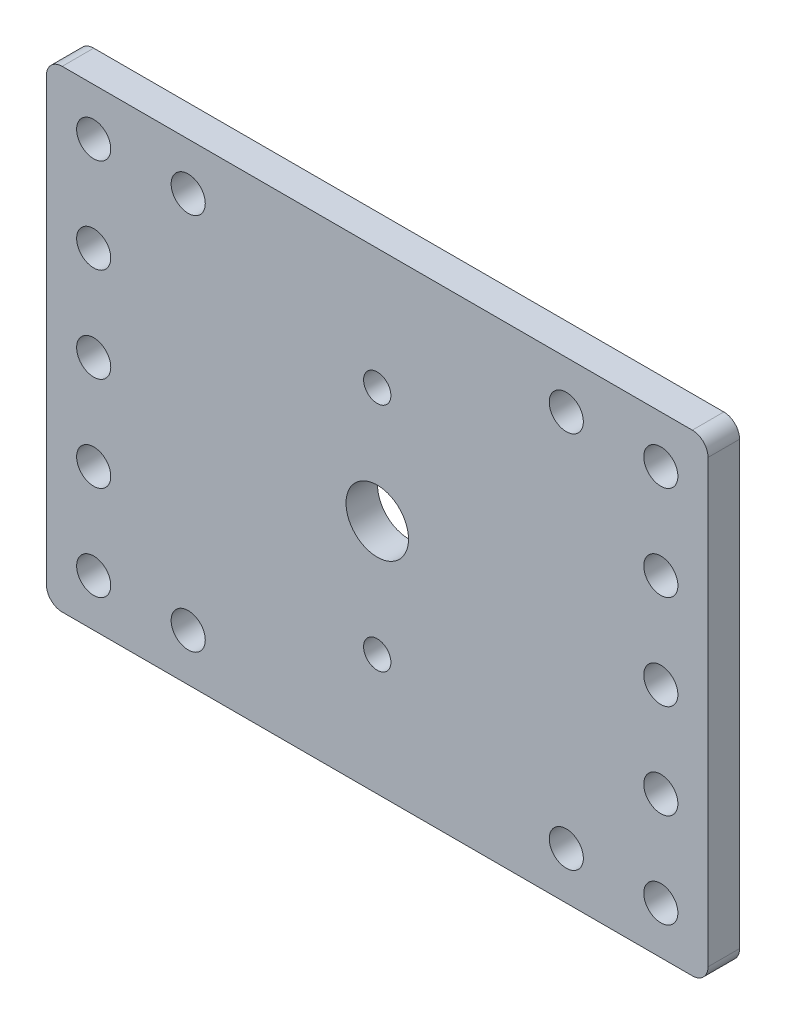
ISO-10303-21;
HEADER;
FILE_DESCRIPTION(('STEP AP214'),'2;1');
FILE_NAME('part.step','',(''),(''),'','','');
FILE_SCHEMA(('AUTOMOTIVE_DESIGN { 1 0 10303 214 1 1 1 1 }'));
ENDSEC;
DATA;
#1=APPLICATION_CONTEXT('core data for automotive mechanical design processes');
#2=APPLICATION_PROTOCOL_DEFINITION('international standard','automotive_design',2000,#1);
#3=PRODUCT_CONTEXT('',#1,'mechanical');
#4=PRODUCT('Part','Part','',(#3));
#5=PRODUCT_RELATED_PRODUCT_CATEGORY('part','',(#4));
#6=PRODUCT_DEFINITION_FORMATION('','',#4);
#7=PRODUCT_DEFINITION_CONTEXT('part definition',#1,'design');
#8=PRODUCT_DEFINITION('design','',#6,#7);
#9=PRODUCT_DEFINITION_SHAPE('','',#8);
#10=(LENGTH_UNIT() NAMED_UNIT(*) SI_UNIT(.MILLI.,.METRE.));
#11=(NAMED_UNIT(*) PLANE_ANGLE_UNIT() SI_UNIT($,.RADIAN.));
#12=(NAMED_UNIT(*) SI_UNIT($,.STERADIAN.) SOLID_ANGLE_UNIT());
#13=UNCERTAINTY_MEASURE_WITH_UNIT(LENGTH_MEASURE(1.E-05),#10,'distance_accuracy_value','');
#14=(GEOMETRIC_REPRESENTATION_CONTEXT(3) GLOBAL_UNCERTAINTY_ASSIGNED_CONTEXT((#13)) GLOBAL_UNIT_ASSIGNED_CONTEXT((#10,
#11,#12)) REPRESENTATION_CONTEXT('',''));
#15=CARTESIAN_POINT('',(0.,0.,0.));
#16=DIRECTION('',(0.,0.,1.));
#17=DIRECTION('',(1.,0.,0.));
#18=AXIS2_PLACEMENT_3D('',#15,#16,#17);
#19=CARTESIAN_POINT('',(194.757320591,255.7677274561,3.));
#20=DIRECTION('',(0.,0.,1.));
#21=DIRECTION('',(1.,0.,0.));
#22=AXIS2_PLACEMENT_3D('',#19,#20,#21);
#23=PLANE('',#22);
#24=CARTESIAN_POINT('',(251.757320591,243.7677274561,3.));
#25=DIRECTION('',(0.,0.,1.));
#26=DIRECTION('',(1.,0.,0.));
#27=AXIS2_PLACEMENT_3D('',#24,#25,#26);
#28=CIRCLE('',#27,1.62499999999999);
#29=CARTESIAN_POINT('',(253.382320591,243.7677274561,3.));
#30=VERTEX_POINT('',#29);
#31=EDGE_CURVE('E266',#30,#30,#28,.T.);
#32=ORIENTED_EDGE('',*,*,#31,.F.);
#33=EDGE_LOOP('',(#32));
#34=FACE_BOUND('',#33,.T.);
#35=CARTESIAN_POINT('',(197.757320591,243.7677274561,3.));
#36=DIRECTION('',(0.,0.,1.));
#37=DIRECTION('',(1.,0.,0.));
#38=AXIS2_PLACEMENT_3D('',#35,#36,#37);
#39=CIRCLE('',#38,1.62499999999999);
#40=CARTESIAN_POINT('',(199.382320591,243.7677274561,3.));
#41=VERTEX_POINT('',#40);
#42=EDGE_CURVE('E254',#41,#41,#39,.T.);
#43=ORIENTED_EDGE('',*,*,#42,.F.);
#44=EDGE_LOOP('',(#43));
#45=FACE_BOUND('',#44,.T.);
#46=CARTESIAN_POINT('',(197.757320591,234.7677274561,3.));
#47=DIRECTION('',(0.,0.,1.));
#48=DIRECTION('',(1.,0.,0.));
#49=AXIS2_PLACEMENT_3D('',#46,#47,#48);
#50=CIRCLE('',#49,1.62499999999999);
#51=CARTESIAN_POINT('',(199.382320591,234.7677274561,3.));
#52=VERTEX_POINT('',#51);
#53=EDGE_CURVE('E242',#52,#52,#50,.T.);
#54=ORIENTED_EDGE('',*,*,#53,.F.);
#55=EDGE_LOOP('',(#54));
#56=FACE_BOUND('',#55,.T.);
#57=CARTESIAN_POINT('',(251.757320591,216.7677274561,3.));
#58=DIRECTION('',(0.,0.,1.));
#59=DIRECTION('',(1.,0.,0.));
#60=AXIS2_PLACEMENT_3D('',#57,#58,#59);
#61=CIRCLE('',#60,1.62499999999999);
#62=CARTESIAN_POINT('',(253.382320591,216.7677274561,3.));
#63=VERTEX_POINT('',#62);
#64=EDGE_CURVE('E230',#63,#63,#61,.T.);
#65=ORIENTED_EDGE('',*,*,#64,.F.);
#66=EDGE_LOOP('',(#65));
#67=FACE_BOUND('',#66,.T.);
#68=CARTESIAN_POINT('',(197.757320591,252.7677274561,3.));
#69=DIRECTION('',(0.,0.,1.));
#70=DIRECTION('',(1.,0.,0.));
#71=AXIS2_PLACEMENT_3D('',#68,#69,#70);
#72=CIRCLE('',#71,1.62499999999999);
#73=CARTESIAN_POINT('',(199.382320591,252.7677274561,3.));
#74=VERTEX_POINT('',#73);
#75=EDGE_CURVE('E218',#74,#74,#72,.T.);
#76=ORIENTED_EDGE('',*,*,#75,.F.);
#77=EDGE_LOOP('',(#76));
#78=FACE_BOUND('',#77,.T.);
#79=CARTESIAN_POINT('',(224.757320591,223.7677274561,3.));
#80=DIRECTION('',(0.,0.,1.));
#81=DIRECTION('',(1.,0.,0.));
#82=AXIS2_PLACEMENT_3D('',#79,#80,#81);
#83=CIRCLE('',#82,1.3);
#84=CARTESIAN_POINT('',(226.057320591,223.7677274561,3.));
#85=VERTEX_POINT('',#84);
#86=EDGE_CURVE('E206',#85,#85,#83,.T.);
#87=ORIENTED_EDGE('',*,*,#86,.F.);
#88=EDGE_LOOP('',(#87));
#89=FACE_BOUND('',#88,.T.);
#90=CARTESIAN_POINT('',(242.757320591,252.7677274561,3.));
#91=DIRECTION('',(0.,0.,1.));
#92=DIRECTION('',(1.,0.,0.));
#93=AXIS2_PLACEMENT_3D('',#90,#91,#92);
#94=CIRCLE('',#93,1.62499999999999);
#95=CARTESIAN_POINT('',(244.382320591,252.7677274561,3.));
#96=VERTEX_POINT('',#95);
#97=EDGE_CURVE('E194',#96,#96,#94,.T.);
#98=ORIENTED_EDGE('',*,*,#97,.F.);
#99=EDGE_LOOP('',(#98));
#100=FACE_BOUND('',#99,.T.);
#101=CARTESIAN_POINT('',(206.757320591,216.7677274561,3.));
#102=DIRECTION('',(0.,0.,1.));
#103=DIRECTION('',(1.,0.,0.));
#104=AXIS2_PLACEMENT_3D('',#101,#102,#103);
#105=CIRCLE('',#104,1.62499999999999);
#106=CARTESIAN_POINT('',(208.382320591,216.7677274561,3.));
#107=VERTEX_POINT('',#106);
#108=EDGE_CURVE('E182',#107,#107,#105,.T.);
#109=ORIENTED_EDGE('',*,*,#108,.F.);
#110=EDGE_LOOP('',(#109));
#111=FACE_BOUND('',#110,.T.);
#112=CARTESIAN_POINT('',(194.757320591,255.7677274561,3.));
#113=DIRECTION('',(0.,0.,1.));
#114=DIRECTION('',(1.,0.,0.));
#115=AXIS2_PLACEMENT_3D('',#112,#113,#114);
#116=CIRCLE('',#115,1.50000000000003);
#117=CARTESIAN_POINT('',(194.757320591,257.2677274561,3.));
#118=VERTEX_POINT('',#117);
#119=CARTESIAN_POINT('',(193.257320591,255.7677274561,3.));
#120=VERTEX_POINT('',#119);
#121=EDGE_CURVE('E145',#118,#120,#116,.T.);
#122=ORIENTED_EDGE('',*,*,#121,.T.);
#123=DIRECTION('',(0.,-1.,0.));
#124=VECTOR('',#123,1.);
#125=CARTESIAN_POINT('',(193.257320591,213.7677274561,3.));
#126=LINE('',#125,#124);
#127=CARTESIAN_POINT('',(193.257320591,213.7677274561,3.));
#128=VERTEX_POINT('',#127);
#129=EDGE_CURVE('E93',#120,#128,#126,.T.);
#130=ORIENTED_EDGE('',*,*,#129,.T.);
#131=CARTESIAN_POINT('',(194.757320591,213.7677274561,3.));
#132=DIRECTION('',(0.,0.,1.));
#133=DIRECTION('',(1.,0.,0.));
#134=AXIS2_PLACEMENT_3D('',#131,#132,#133);
#135=CIRCLE('',#134,1.5);
#136=CARTESIAN_POINT('',(194.757320591,212.2677274561,3.));
#137=VERTEX_POINT('',#136);
#138=EDGE_CURVE('E160',#128,#137,#135,.T.);
#139=ORIENTED_EDGE('',*,*,#138,.T.);
#140=DIRECTION('',(1.,0.,0.));
#141=VECTOR('',#140,1.);
#142=CARTESIAN_POINT('',(254.757320591,212.2677274561,3.));
#143=LINE('',#142,#141);
#144=CARTESIAN_POINT('',(254.757320591,212.2677274561,3.));
#145=VERTEX_POINT('',#144);
#146=EDGE_CURVE('E173',#137,#145,#143,.T.);
#147=ORIENTED_EDGE('',*,*,#146,.T.);
#148=CARTESIAN_POINT('',(254.757320591,213.7677274561,3.));
#149=DIRECTION('',(0.,0.,1.));
#150=DIRECTION('',(1.,0.,0.));
#151=AXIS2_PLACEMENT_3D('',#148,#149,#150);
#152=CIRCLE('',#151,1.5);
#153=CARTESIAN_POINT('',(256.257320591,213.7677274561,3.));
#154=VERTEX_POINT('',#153);
#155=EDGE_CURVE('E112',#145,#154,#152,.T.);
#156=ORIENTED_EDGE('',*,*,#155,.T.);
#157=DIRECTION('',(0.,1.,0.));
#158=VECTOR('',#157,1.);
#159=CARTESIAN_POINT('',(256.257320591,255.7677274561,3.));
#160=LINE('',#159,#158);
#161=CARTESIAN_POINT('',(256.257320591,255.7677274561,3.));
#162=VERTEX_POINT('',#161);
#163=EDGE_CURVE('E106',#154,#162,#160,.T.);
#164=ORIENTED_EDGE('',*,*,#163,.T.);
#165=CARTESIAN_POINT('',(254.757320591,255.7677274561,3.));
#166=DIRECTION('',(0.,0.,1.));
#167=DIRECTION('',(1.,0.,0.));
#168=AXIS2_PLACEMENT_3D('',#165,#166,#167);
#169=CIRCLE('',#168,1.5);
#170=CARTESIAN_POINT('',(254.757320591,257.2677274561,3.));
#171=VERTEX_POINT('',#170);
#172=EDGE_CURVE('E110',#162,#171,#169,.T.);
#173=ORIENTED_EDGE('',*,*,#172,.T.);
#174=DIRECTION('',(-1.,0.,0.));
#175=VECTOR('',#174,1.);
#176=CARTESIAN_POINT('',(194.757320591,257.2677274561,3.));
#177=LINE('',#176,#175);
#178=EDGE_CURVE('E50',#171,#118,#177,.T.);
#179=ORIENTED_EDGE('',*,*,#178,.T.);
#180=EDGE_LOOP('',(#122,#130,#139,#147,#156,#164,#173,#179));
#181=FACE_BOUND('',#180,.T.);
#182=CARTESIAN_POINT('',(206.757320591,252.7677274561,3.));
#183=DIRECTION('',(0.,0.,1.));
#184=DIRECTION('',(1.,0.,0.));
#185=AXIS2_PLACEMENT_3D('',#182,#183,#184);
#186=CIRCLE('',#185,1.62499999999999);
#187=CARTESIAN_POINT('',(208.382320591,252.7677274561,3.));
#188=VERTEX_POINT('',#187);
#189=EDGE_CURVE('E134',#188,#188,#186,.T.);
#190=ORIENTED_EDGE('',*,*,#189,.F.);
#191=EDGE_LOOP('',(#190));
#192=FACE_BOUND('',#191,.T.);
#193=CARTESIAN_POINT('',(224.757320591,234.7677274561,3.));
#194=DIRECTION('',(0.,0.,1.));
#195=DIRECTION('',(1.,0.,0.));
#196=AXIS2_PLACEMENT_3D('',#193,#194,#195);
#197=CIRCLE('',#196,2.97500000000001);
#198=CARTESIAN_POINT('',(227.732320591,234.7677274561,3.));
#199=VERTEX_POINT('',#198);
#200=EDGE_CURVE('E188',#199,#199,#197,.T.);
#201=ORIENTED_EDGE('',*,*,#200,.F.);
#202=EDGE_LOOP('',(#201));
#203=FACE_BOUND('',#202,.T.);
#204=CARTESIAN_POINT('',(242.757320591,216.7677274561,3.));
#205=DIRECTION('',(0.,0.,1.));
#206=DIRECTION('',(1.,0.,0.));
#207=AXIS2_PLACEMENT_3D('',#204,#205,#206);
#208=CIRCLE('',#207,1.62499999999999);
#209=CARTESIAN_POINT('',(244.382320591,216.7677274561,3.));
#210=VERTEX_POINT('',#209);
#211=EDGE_CURVE('E200',#210,#210,#208,.T.);
#212=ORIENTED_EDGE('',*,*,#211,.F.);
#213=EDGE_LOOP('',(#212));
#214=FACE_BOUND('',#213,.T.);
#215=CARTESIAN_POINT('',(224.757320591,245.7677274561,3.));
#216=DIRECTION('',(0.,0.,1.));
#217=DIRECTION('',(1.,0.,0.));
#218=AXIS2_PLACEMENT_3D('',#215,#216,#217);
#219=CIRCLE('',#218,1.3);
#220=CARTESIAN_POINT('',(226.057320591,245.7677274561,3.));
#221=VERTEX_POINT('',#220);
#222=EDGE_CURVE('E212',#221,#221,#219,.T.);
#223=ORIENTED_EDGE('',*,*,#222,.F.);
#224=EDGE_LOOP('',(#223));
#225=FACE_BOUND('',#224,.T.);
#226=CARTESIAN_POINT('',(251.757320591,252.7677274561,3.));
#227=DIRECTION('',(0.,0.,1.));
#228=DIRECTION('',(1.,0.,0.));
#229=AXIS2_PLACEMENT_3D('',#226,#227,#228);
#230=CIRCLE('',#229,1.62499999999999);
#231=CARTESIAN_POINT('',(253.382320591,252.7677274561,3.));
#232=VERTEX_POINT('',#231);
#233=EDGE_CURVE('E224',#232,#232,#230,.T.);
#234=ORIENTED_EDGE('',*,*,#233,.F.);
#235=EDGE_LOOP('',(#234));
#236=FACE_BOUND('',#235,.T.);
#237=CARTESIAN_POINT('',(197.757320591,216.7677274561,3.));
#238=DIRECTION('',(0.,0.,1.));
#239=DIRECTION('',(1.,0.,0.));
#240=AXIS2_PLACEMENT_3D('',#237,#238,#239);
#241=CIRCLE('',#240,1.62499999999999);
#242=CARTESIAN_POINT('',(199.382320591,216.7677274561,3.));
#243=VERTEX_POINT('',#242);
#244=EDGE_CURVE('E236',#243,#243,#241,.T.);
#245=ORIENTED_EDGE('',*,*,#244,.F.);
#246=EDGE_LOOP('',(#245));
#247=FACE_BOUND('',#246,.T.);
#248=CARTESIAN_POINT('',(251.757320591,234.7677274561,3.));
#249=DIRECTION('',(0.,0.,1.));
#250=DIRECTION('',(1.,0.,0.));
#251=AXIS2_PLACEMENT_3D('',#248,#249,#250);
#252=CIRCLE('',#251,1.62499999999999);
#253=CARTESIAN_POINT('',(253.382320591,234.7677274561,3.));
#254=VERTEX_POINT('',#253);
#255=EDGE_CURVE('E248',#254,#254,#252,.T.);
#256=ORIENTED_EDGE('',*,*,#255,.F.);
#257=EDGE_LOOP('',(#256));
#258=FACE_BOUND('',#257,.T.);
#259=CARTESIAN_POINT('',(197.757320591,225.7677274561,3.));
#260=DIRECTION('',(0.,0.,1.));
#261=DIRECTION('',(1.,0.,0.));
#262=AXIS2_PLACEMENT_3D('',#259,#260,#261);
#263=CIRCLE('',#262,1.62499999999999);
#264=CARTESIAN_POINT('',(199.382320591,225.7677274561,3.));
#265=VERTEX_POINT('',#264);
#266=EDGE_CURVE('E260',#265,#265,#263,.T.);
#267=ORIENTED_EDGE('',*,*,#266,.F.);
#268=EDGE_LOOP('',(#267));
#269=FACE_BOUND('',#268,.T.);
#270=CARTESIAN_POINT('',(251.757320591,225.7677274561,3.));
#271=DIRECTION('',(0.,0.,1.));
#272=DIRECTION('',(1.,0.,0.));
#273=AXIS2_PLACEMENT_3D('',#270,#271,#272);
#274=CIRCLE('',#273,1.62499999999999);
#275=CARTESIAN_POINT('',(253.382320591,225.7677274561,3.));
#276=VERTEX_POINT('',#275);
#277=EDGE_CURVE('E272',#276,#276,#274,.T.);
#278=ORIENTED_EDGE('',*,*,#277,.F.);
#279=EDGE_LOOP('',(#278));
#280=FACE_BOUND('',#279,.T.);
#281=ADVANCED_FACE('F33',(#34,#45,#56,#67,#78,#89,#100,#111,#181,#192,#203,#214,#225,#236,#247,
#258,#269,#280),#23,.T.);
#282=CARTESIAN_POINT('',(194.757320591,255.7677274561,0.));
#283=DIRECTION('',(0.,0.,1.));
#284=DIRECTION('',(1.,0.,0.));
#285=AXIS2_PLACEMENT_3D('',#282,#283,#284);
#286=PLANE('',#285);
#287=CARTESIAN_POINT('',(251.757320591,243.7677274561,0.));
#288=DIRECTION('',(0.,0.,1.));
#289=DIRECTION('',(1.,0.,0.));
#290=AXIS2_PLACEMENT_3D('',#287,#288,#289);
#291=CIRCLE('',#290,1.62499999999999);
#292=CARTESIAN_POINT('',(253.382320591,243.7677274561,0.));
#293=VERTEX_POINT('',#292);
#294=EDGE_CURVE('E269',#293,#293,#291,.T.);
#295=ORIENTED_EDGE('',*,*,#294,.T.);
#296=EDGE_LOOP('',(#295));
#297=FACE_BOUND('',#296,.T.);
#298=CARTESIAN_POINT('',(197.757320591,243.7677274561,0.));
#299=DIRECTION('',(0.,0.,1.));
#300=DIRECTION('',(1.,0.,0.));
#301=AXIS2_PLACEMENT_3D('',#298,#299,#300);
#302=CIRCLE('',#301,1.62499999999999);
#303=CARTESIAN_POINT('',(199.382320591,243.7677274561,0.));
#304=VERTEX_POINT('',#303);
#305=EDGE_CURVE('E257',#304,#304,#302,.T.);
#306=ORIENTED_EDGE('',*,*,#305,.T.);
#307=EDGE_LOOP('',(#306));
#308=FACE_BOUND('',#307,.T.);
#309=CARTESIAN_POINT('',(197.757320591,234.7677274561,0.));
#310=DIRECTION('',(0.,0.,1.));
#311=DIRECTION('',(1.,0.,0.));
#312=AXIS2_PLACEMENT_3D('',#309,#310,#311);
#313=CIRCLE('',#312,1.62499999999999);
#314=CARTESIAN_POINT('',(199.382320591,234.7677274561,0.));
#315=VERTEX_POINT('',#314);
#316=EDGE_CURVE('E245',#315,#315,#313,.T.);
#317=ORIENTED_EDGE('',*,*,#316,.T.);
#318=EDGE_LOOP('',(#317));
#319=FACE_BOUND('',#318,.T.);
#320=CARTESIAN_POINT('',(251.757320591,216.7677274561,0.));
#321=DIRECTION('',(0.,0.,1.));
#322=DIRECTION('',(1.,0.,0.));
#323=AXIS2_PLACEMENT_3D('',#320,#321,#322);
#324=CIRCLE('',#323,1.62499999999999);
#325=CARTESIAN_POINT('',(253.382320591,216.7677274561,0.));
#326=VERTEX_POINT('',#325);
#327=EDGE_CURVE('E233',#326,#326,#324,.T.);
#328=ORIENTED_EDGE('',*,*,#327,.T.);
#329=EDGE_LOOP('',(#328));
#330=FACE_BOUND('',#329,.T.);
#331=CARTESIAN_POINT('',(197.757320591,252.7677274561,0.));
#332=DIRECTION('',(0.,0.,1.));
#333=DIRECTION('',(1.,0.,0.));
#334=AXIS2_PLACEMENT_3D('',#331,#332,#333);
#335=CIRCLE('',#334,1.62499999999999);
#336=CARTESIAN_POINT('',(199.382320591,252.7677274561,0.));
#337=VERTEX_POINT('',#336);
#338=EDGE_CURVE('E221',#337,#337,#335,.T.);
#339=ORIENTED_EDGE('',*,*,#338,.T.);
#340=EDGE_LOOP('',(#339));
#341=FACE_BOUND('',#340,.T.);
#342=CARTESIAN_POINT('',(224.757320591,223.7677274561,0.));
#343=DIRECTION('',(0.,0.,1.));
#344=DIRECTION('',(1.,0.,0.));
#345=AXIS2_PLACEMENT_3D('',#342,#343,#344);
#346=CIRCLE('',#345,1.3);
#347=CARTESIAN_POINT('',(226.057320591,223.7677274561,0.));
#348=VERTEX_POINT('',#347);
#349=EDGE_CURVE('E209',#348,#348,#346,.T.);
#350=ORIENTED_EDGE('',*,*,#349,.T.);
#351=EDGE_LOOP('',(#350));
#352=FACE_BOUND('',#351,.T.);
#353=CARTESIAN_POINT('',(242.757320591,252.7677274561,0.));
#354=DIRECTION('',(0.,0.,1.));
#355=DIRECTION('',(1.,0.,0.));
#356=AXIS2_PLACEMENT_3D('',#353,#354,#355);
#357=CIRCLE('',#356,1.62499999999999);
#358=CARTESIAN_POINT('',(244.382320591,252.7677274561,0.));
#359=VERTEX_POINT('',#358);
#360=EDGE_CURVE('E197',#359,#359,#357,.T.);
#361=ORIENTED_EDGE('',*,*,#360,.T.);
#362=EDGE_LOOP('',(#361));
#363=FACE_BOUND('',#362,.T.);
#364=CARTESIAN_POINT('',(206.757320591,216.7677274561,0.));
#365=DIRECTION('',(0.,0.,1.));
#366=DIRECTION('',(1.,0.,0.));
#367=AXIS2_PLACEMENT_3D('',#364,#365,#366);
#368=CIRCLE('',#367,1.62499999999999);
#369=CARTESIAN_POINT('',(208.382320591,216.7677274561,0.));
#370=VERTEX_POINT('',#369);
#371=EDGE_CURVE('E185',#370,#370,#368,.T.);
#372=ORIENTED_EDGE('',*,*,#371,.T.);
#373=EDGE_LOOP('',(#372));
#374=FACE_BOUND('',#373,.T.);
#375=CARTESIAN_POINT('',(194.757320591,255.7677274561,0.));
#376=DIRECTION('',(0.,0.,1.));
#377=DIRECTION('',(1.,0.,0.));
#378=AXIS2_PLACEMENT_3D('',#375,#376,#377);
#379=CIRCLE('',#378,1.50000000000003);
#380=CARTESIAN_POINT('',(194.757320591,257.2677274561,0.));
#381=VERTEX_POINT('',#380);
#382=CARTESIAN_POINT('',(193.257320591,255.7677274561,0.));
#383=VERTEX_POINT('',#382);
#384=EDGE_CURVE('E130',#381,#383,#379,.T.);
#385=ORIENTED_EDGE('',*,*,#384,.F.);
#386=DIRECTION('',(-1.,0.,0.));
#387=VECTOR('',#386,1.);
#388=CARTESIAN_POINT('',(194.757320591,257.2677274561,0.));
#389=LINE('',#388,#387);
#390=CARTESIAN_POINT('',(254.757320591,257.2677274561,0.));
#391=VERTEX_POINT('',#390);
#392=EDGE_CURVE('E85',#391,#381,#389,.T.);
#393=ORIENTED_EDGE('',*,*,#392,.F.);
#394=CARTESIAN_POINT('',(254.757320591,255.7677274561,0.));
#395=DIRECTION('',(0.,0.,1.));
#396=DIRECTION('',(1.,0.,0.));
#397=AXIS2_PLACEMENT_3D('',#394,#395,#396);
#398=CIRCLE('',#397,1.5);
#399=CARTESIAN_POINT('',(256.257320591,255.7677274561,0.));
#400=VERTEX_POINT('',#399);
#401=EDGE_CURVE('E79',#400,#391,#398,.T.);
#402=ORIENTED_EDGE('',*,*,#401,.F.);
#403=DIRECTION('',(0.,1.,0.));
#404=VECTOR('',#403,1.);
#405=CARTESIAN_POINT('',(256.257320591,255.7677274561,0.));
#406=LINE('',#405,#404);
#407=CARTESIAN_POINT('',(256.257320591,213.7677274561,0.));
#408=VERTEX_POINT('',#407);
#409=EDGE_CURVE('E120',#408,#400,#406,.T.);
#410=ORIENTED_EDGE('',*,*,#409,.F.);
#411=CARTESIAN_POINT('',(254.757320591,213.7677274561,0.));
#412=DIRECTION('',(0.,0.,1.));
#413=DIRECTION('',(1.,0.,0.));
#414=AXIS2_PLACEMENT_3D('',#411,#412,#413);
#415=CIRCLE('',#414,1.5);
#416=CARTESIAN_POINT('',(254.757320591,212.2677274561,0.));
#417=VERTEX_POINT('',#416);
#418=EDGE_CURVE('E140',#417,#408,#415,.T.);
#419=ORIENTED_EDGE('',*,*,#418,.F.);
#420=DIRECTION('',(1.,0.,0.));
#421=VECTOR('',#420,1.);
#422=CARTESIAN_POINT('',(254.757320591,212.2677274561,0.));
#423=LINE('',#422,#421);
#424=CARTESIAN_POINT('',(194.757320591,212.2677274561,0.));
#425=VERTEX_POINT('',#424);
#426=EDGE_CURVE('E138',#425,#417,#423,.T.);
#427=ORIENTED_EDGE('',*,*,#426,.F.);
#428=CARTESIAN_POINT('',(194.757320591,213.7677274561,0.));
#429=DIRECTION('',(0.,0.,1.));
#430=DIRECTION('',(1.,0.,0.));
#431=AXIS2_PLACEMENT_3D('',#428,#429,#430);
#432=CIRCLE('',#431,1.5);
#433=CARTESIAN_POINT('',(193.257320591,213.7677274561,0.));
#434=VERTEX_POINT('',#433);
#435=EDGE_CURVE('E136',#434,#425,#432,.T.);
#436=ORIENTED_EDGE('',*,*,#435,.F.);
#437=DIRECTION('',(0.,-1.,0.));
#438=VECTOR('',#437,1.);
#439=CARTESIAN_POINT('',(193.257320591,213.7677274561,0.));
#440=LINE('',#439,#438);
#441=EDGE_CURVE('E133',#383,#434,#440,.T.);
#442=ORIENTED_EDGE('',*,*,#441,.F.);
#443=EDGE_LOOP('',(#385,#393,#402,#410,#419,#427,#436,#442));
#444=FACE_BOUND('',#443,.T.);
#445=CARTESIAN_POINT('',(206.757320591,252.7677274561,0.));
#446=DIRECTION('',(0.,0.,1.));
#447=DIRECTION('',(1.,0.,0.));
#448=AXIS2_PLACEMENT_3D('',#445,#446,#447);
#449=CIRCLE('',#448,1.62499999999999);
#450=CARTESIAN_POINT('',(208.382320591,252.7677274561,0.));
#451=VERTEX_POINT('',#450);
#452=EDGE_CURVE('E179',#451,#451,#449,.T.);
#453=ORIENTED_EDGE('',*,*,#452,.T.);
#454=EDGE_LOOP('',(#453));
#455=FACE_BOUND('',#454,.T.);
#456=CARTESIAN_POINT('',(224.757320591,234.7677274561,0.));
#457=DIRECTION('',(0.,0.,1.));
#458=DIRECTION('',(1.,0.,0.));
#459=AXIS2_PLACEMENT_3D('',#456,#457,#458);
#460=CIRCLE('',#459,2.97500000000001);
#461=CARTESIAN_POINT('',(227.732320591,234.7677274561,0.));
#462=VERTEX_POINT('',#461);
#463=EDGE_CURVE('E191',#462,#462,#460,.T.);
#464=ORIENTED_EDGE('',*,*,#463,.T.);
#465=EDGE_LOOP('',(#464));
#466=FACE_BOUND('',#465,.T.);
#467=CARTESIAN_POINT('',(242.757320591,216.7677274561,0.));
#468=DIRECTION('',(0.,0.,1.));
#469=DIRECTION('',(1.,0.,0.));
#470=AXIS2_PLACEMENT_3D('',#467,#468,#469);
#471=CIRCLE('',#470,1.62499999999999);
#472=CARTESIAN_POINT('',(244.382320591,216.7677274561,0.));
#473=VERTEX_POINT('',#472);
#474=EDGE_CURVE('E203',#473,#473,#471,.T.);
#475=ORIENTED_EDGE('',*,*,#474,.T.);
#476=EDGE_LOOP('',(#475));
#477=FACE_BOUND('',#476,.T.);
#478=CARTESIAN_POINT('',(224.757320591,245.7677274561,0.));
#479=DIRECTION('',(0.,0.,1.));
#480=DIRECTION('',(1.,0.,0.));
#481=AXIS2_PLACEMENT_3D('',#478,#479,#480);
#482=CIRCLE('',#481,1.3);
#483=CARTESIAN_POINT('',(226.057320591,245.7677274561,0.));
#484=VERTEX_POINT('',#483);
#485=EDGE_CURVE('E215',#484,#484,#482,.T.);
#486=ORIENTED_EDGE('',*,*,#485,.T.);
#487=EDGE_LOOP('',(#486));
#488=FACE_BOUND('',#487,.T.);
#489=CARTESIAN_POINT('',(251.757320591,252.7677274561,0.));
#490=DIRECTION('',(0.,0.,1.));
#491=DIRECTION('',(1.,0.,0.));
#492=AXIS2_PLACEMENT_3D('',#489,#490,#491);
#493=CIRCLE('',#492,1.62499999999999);
#494=CARTESIAN_POINT('',(253.382320591,252.7677274561,0.));
#495=VERTEX_POINT('',#494);
#496=EDGE_CURVE('E227',#495,#495,#493,.T.);
#497=ORIENTED_EDGE('',*,*,#496,.T.);
#498=EDGE_LOOP('',(#497));
#499=FACE_BOUND('',#498,.T.);
#500=CARTESIAN_POINT('',(197.757320591,216.7677274561,0.));
#501=DIRECTION('',(0.,0.,1.));
#502=DIRECTION('',(1.,0.,0.));
#503=AXIS2_PLACEMENT_3D('',#500,#501,#502);
#504=CIRCLE('',#503,1.62499999999999);
#505=CARTESIAN_POINT('',(199.382320591,216.7677274561,0.));
#506=VERTEX_POINT('',#505);
#507=EDGE_CURVE('E239',#506,#506,#504,.T.);
#508=ORIENTED_EDGE('',*,*,#507,.T.);
#509=EDGE_LOOP('',(#508));
#510=FACE_BOUND('',#509,.T.);
#511=CARTESIAN_POINT('',(251.757320591,234.7677274561,0.));
#512=DIRECTION('',(0.,0.,1.));
#513=DIRECTION('',(1.,0.,0.));
#514=AXIS2_PLACEMENT_3D('',#511,#512,#513);
#515=CIRCLE('',#514,1.62499999999999);
#516=CARTESIAN_POINT('',(253.382320591,234.7677274561,0.));
#517=VERTEX_POINT('',#516);
#518=EDGE_CURVE('E251',#517,#517,#515,.T.);
#519=ORIENTED_EDGE('',*,*,#518,.T.);
#520=EDGE_LOOP('',(#519));
#521=FACE_BOUND('',#520,.T.);
#522=CARTESIAN_POINT('',(197.757320591,225.7677274561,0.));
#523=DIRECTION('',(0.,0.,1.));
#524=DIRECTION('',(1.,0.,0.));
#525=AXIS2_PLACEMENT_3D('',#522,#523,#524);
#526=CIRCLE('',#525,1.62499999999999);
#527=CARTESIAN_POINT('',(199.382320591,225.7677274561,0.));
#528=VERTEX_POINT('',#527);
#529=EDGE_CURVE('E263',#528,#528,#526,.T.);
#530=ORIENTED_EDGE('',*,*,#529,.T.);
#531=EDGE_LOOP('',(#530));
#532=FACE_BOUND('',#531,.T.);
#533=CARTESIAN_POINT('',(251.757320591,225.7677274561,0.));
#534=DIRECTION('',(0.,0.,1.));
#535=DIRECTION('',(1.,0.,0.));
#536=AXIS2_PLACEMENT_3D('',#533,#534,#535);
#537=CIRCLE('',#536,1.62499999999999);
#538=CARTESIAN_POINT('',(253.382320591,225.7677274561,0.));
#539=VERTEX_POINT('',#538);
#540=EDGE_CURVE('E275',#539,#539,#537,.T.);
#541=ORIENTED_EDGE('',*,*,#540,.T.);
#542=EDGE_LOOP('',(#541));
#543=FACE_BOUND('',#542,.T.);
#544=ADVANCED_FACE('F164',(#297,#308,#319,#330,#341,#352,#363,#374,#444,#455,#466,#477,#488,
#499,#510,#521,#532,#543),#286,.F.);
#545=CARTESIAN_POINT('',(194.757320591,255.7677274561,3.));
#546=DIRECTION('',(0.,0.,-1.));
#547=DIRECTION('',(-1.,0.,0.));
#548=AXIS2_PLACEMENT_3D('',#545,#546,#547);
#549=CYLINDRICAL_SURFACE('',#548,1.50000000000003);
#550=ORIENTED_EDGE('',*,*,#384,.T.);
#551=DIRECTION('',(0.,0.,-1.));
#552=VECTOR('',#551,1.);
#553=CARTESIAN_POINT('',(193.257320591,255.7677274561,3.));
#554=LINE('',#553,#552);
#555=EDGE_CURVE('E11',#120,#383,#554,.T.);
#556=ORIENTED_EDGE('',*,*,#555,.F.);
#557=ORIENTED_EDGE('',*,*,#121,.F.);
#558=DIRECTION('',(0.,0.,-1.));
#559=VECTOR('',#558,1.);
#560=CARTESIAN_POINT('',(194.757320591,257.2677274561,3.));
#561=LINE('',#560,#559);
#562=EDGE_CURVE('E126',#118,#381,#561,.T.);
#563=ORIENTED_EDGE('',*,*,#562,.T.);
#564=EDGE_LOOP('',(#550,#556,#557,#563));
#565=FACE_BOUND('',#564,.T.);
#566=ADVANCED_FACE('F35',(#565),#549,.T.);
#567=CARTESIAN_POINT('',(193.257320591,213.7677274561,3.));
#568=DIRECTION('',(1.,0.,0.));
#569=DIRECTION('',(0.,0.,-1.));
#570=AXIS2_PLACEMENT_3D('',#567,#568,#569);
#571=PLANE('',#570);
#572=ORIENTED_EDGE('',*,*,#441,.T.);
#573=DIRECTION('',(0.,0.,-1.));
#574=VECTOR('',#573,1.);
#575=CARTESIAN_POINT('',(193.257320591,213.7677274561,3.));
#576=LINE('',#575,#574);
#577=EDGE_CURVE('E42',#128,#434,#576,.T.);
#578=ORIENTED_EDGE('',*,*,#577,.F.);
#579=ORIENTED_EDGE('',*,*,#129,.F.);
#580=ORIENTED_EDGE('',*,*,#555,.T.);
#581=EDGE_LOOP('',(#572,#578,#579,#580));
#582=FACE_BOUND('',#581,.T.);
#583=ADVANCED_FACE('F310',(#582),#571,.F.);
#584=CARTESIAN_POINT('',(194.757320591,213.7677274561,3.));
#585=DIRECTION('',(0.,0.,-1.));
#586=DIRECTION('',(-1.,0.,0.));
#587=AXIS2_PLACEMENT_3D('',#584,#585,#586);
#588=CYLINDRICAL_SURFACE('',#587,1.5);
#589=ORIENTED_EDGE('',*,*,#435,.T.);
#590=DIRECTION('',(0.,0.,-1.));
#591=VECTOR('',#590,1.);
#592=CARTESIAN_POINT('',(194.757320591,212.2677274561,3.));
#593=LINE('',#592,#591);
#594=EDGE_CURVE('E152',#137,#425,#593,.T.);
#595=ORIENTED_EDGE('',*,*,#594,.F.);
#596=ORIENTED_EDGE('',*,*,#138,.F.);
#597=ORIENTED_EDGE('',*,*,#577,.T.);
#598=EDGE_LOOP('',(#589,#595,#596,#597));
#599=FACE_BOUND('',#598,.T.);
#600=ADVANCED_FACE('F158',(#599),#588,.T.);
#601=CARTESIAN_POINT('',(254.757320591,212.2677274561,3.));
#602=DIRECTION('',(0.,1.,0.));
#603=DIRECTION('',(0.,0.,1.));
#604=AXIS2_PLACEMENT_3D('',#601,#602,#603);
#605=PLANE('',#604);
#606=ORIENTED_EDGE('',*,*,#426,.T.);
#607=DIRECTION('',(0.,0.,-1.));
#608=VECTOR('',#607,1.);
#609=CARTESIAN_POINT('',(254.757320591,212.2677274561,3.));
#610=LINE('',#609,#608);
#611=EDGE_CURVE('E149',#145,#417,#610,.T.);
#612=ORIENTED_EDGE('',*,*,#611,.F.);
#613=ORIENTED_EDGE('',*,*,#146,.F.);
#614=ORIENTED_EDGE('',*,*,#594,.T.);
#615=EDGE_LOOP('',(#606,#612,#613,#614));
#616=FACE_BOUND('',#615,.T.);
#617=ADVANCED_FACE('F169',(#616),#605,.F.);
#618=CARTESIAN_POINT('',(254.757320591,213.7677274561,3.));
#619=DIRECTION('',(0.,0.,-1.));
#620=DIRECTION('',(-1.,0.,0.));
#621=AXIS2_PLACEMENT_3D('',#618,#619,#620);
#622=CYLINDRICAL_SURFACE('',#621,1.5);
#623=ORIENTED_EDGE('',*,*,#418,.T.);
#624=DIRECTION('',(0.,0.,-1.));
#625=VECTOR('',#624,1.);
#626=CARTESIAN_POINT('',(256.257320591,213.7677274561,3.));
#627=LINE('',#626,#625);
#628=EDGE_CURVE('E121',#154,#408,#627,.T.);
#629=ORIENTED_EDGE('',*,*,#628,.F.);
#630=ORIENTED_EDGE('',*,*,#155,.F.);
#631=ORIENTED_EDGE('',*,*,#611,.T.);
#632=EDGE_LOOP('',(#623,#629,#630,#631));
#633=FACE_BOUND('',#632,.T.);
#634=ADVANCED_FACE('F172',(#633),#622,.T.);
#635=CARTESIAN_POINT('',(256.257320591,255.7677274561,3.));
#636=DIRECTION('',(-1.,0.,0.));
#637=DIRECTION('',(0.,0.,1.));
#638=AXIS2_PLACEMENT_3D('',#635,#636,#637);
#639=PLANE('',#638);
#640=ORIENTED_EDGE('',*,*,#409,.T.);
#641=DIRECTION('',(0.,0.,-1.));
#642=VECTOR('',#641,1.);
#643=CARTESIAN_POINT('',(256.257320591,255.7677274561,3.));
#644=LINE('',#643,#642);
#645=EDGE_CURVE('E117',#162,#400,#644,.T.);
#646=ORIENTED_EDGE('',*,*,#645,.F.);
#647=ORIENTED_EDGE('',*,*,#163,.F.);
#648=ORIENTED_EDGE('',*,*,#628,.T.);
#649=EDGE_LOOP('',(#640,#646,#647,#648));
#650=FACE_BOUND('',#649,.T.);
#651=ADVANCED_FACE('F118',(#650),#639,.F.);
#652=CARTESIAN_POINT('',(254.757320591,255.7677274561,3.));
#653=DIRECTION('',(0.,0.,-1.));
#654=DIRECTION('',(-1.,0.,0.));
#655=AXIS2_PLACEMENT_3D('',#652,#653,#654);
#656=CYLINDRICAL_SURFACE('',#655,1.5);
#657=ORIENTED_EDGE('',*,*,#401,.T.);
#658=DIRECTION('',(0.,0.,-1.));
#659=VECTOR('',#658,1.);
#660=CARTESIAN_POINT('',(254.757320591,257.2677274561,3.));
#661=LINE('',#660,#659);
#662=EDGE_CURVE('E122',#171,#391,#661,.T.);
#663=ORIENTED_EDGE('',*,*,#662,.F.);
#664=ORIENTED_EDGE('',*,*,#172,.F.);
#665=ORIENTED_EDGE('',*,*,#645,.T.);
#666=EDGE_LOOP('',(#657,#663,#664,#665));
#667=FACE_BOUND('',#666,.T.);
#668=ADVANCED_FACE('F124',(#667),#656,.T.);
#669=CARTESIAN_POINT('',(194.757320591,257.2677274561,3.));
#670=DIRECTION('',(0.,-1.,0.));
#671=DIRECTION('',(0.,0.,-1.));
#672=AXIS2_PLACEMENT_3D('',#669,#670,#671);
#673=PLANE('',#672);
#674=ORIENTED_EDGE('',*,*,#392,.T.);
#675=ORIENTED_EDGE('',*,*,#562,.F.);
#676=ORIENTED_EDGE('',*,*,#178,.F.);
#677=ORIENTED_EDGE('',*,*,#662,.T.);
#678=EDGE_LOOP('',(#674,#675,#676,#677));
#679=FACE_BOUND('',#678,.T.);
#680=ADVANCED_FACE('F298',(#679),#673,.F.);
#681=CARTESIAN_POINT('',(206.757320591,252.7677274561,3.));
#682=DIRECTION('',(0.,0.,-1.));
#683=DIRECTION('',(-1.,0.,0.));
#684=AXIS2_PLACEMENT_3D('',#681,#682,#683);
#685=CYLINDRICAL_SURFACE('',#684,1.62499999999999);
#686=ORIENTED_EDGE('',*,*,#189,.T.);
#687=EDGE_LOOP('',(#686));
#688=FACE_BOUND('',#687,.T.);
#689=ORIENTED_EDGE('',*,*,#452,.F.);
#690=EDGE_LOOP('',(#689));
#691=FACE_BOUND('',#690,.T.);
#692=ADVANCED_FACE('F295',(#688,#691),#685,.F.);
#693=CARTESIAN_POINT('',(206.757320591,216.7677274561,3.));
#694=DIRECTION('',(0.,0.,-1.));
#695=DIRECTION('',(-1.,0.,0.));
#696=AXIS2_PLACEMENT_3D('',#693,#694,#695);
#697=CYLINDRICAL_SURFACE('',#696,1.62499999999999);
#698=ORIENTED_EDGE('',*,*,#108,.T.);
#699=EDGE_LOOP('',(#698));
#700=FACE_BOUND('',#699,.T.);
#701=ORIENTED_EDGE('',*,*,#371,.F.);
#702=EDGE_LOOP('',(#701));
#703=FACE_BOUND('',#702,.T.);
#704=ADVANCED_FACE('F374',(#700,#703),#697,.F.);
#705=CARTESIAN_POINT('',(224.757320591,234.7677274561,3.));
#706=DIRECTION('',(0.,0.,-1.));
#707=DIRECTION('',(-1.,0.,0.));
#708=AXIS2_PLACEMENT_3D('',#705,#706,#707);
#709=CYLINDRICAL_SURFACE('',#708,2.97500000000001);
#710=ORIENTED_EDGE('',*,*,#200,.T.);
#711=EDGE_LOOP('',(#710));
#712=FACE_BOUND('',#711,.T.);
#713=ORIENTED_EDGE('',*,*,#463,.F.);
#714=EDGE_LOOP('',(#713));
#715=FACE_BOUND('',#714,.T.);
#716=ADVANCED_FACE('F382',(#712,#715),#709,.F.);
#717=CARTESIAN_POINT('',(242.757320591,252.7677274561,3.));
#718=DIRECTION('',(0.,0.,-1.));
#719=DIRECTION('',(-1.,0.,0.));
#720=AXIS2_PLACEMENT_3D('',#717,#718,#719);
#721=CYLINDRICAL_SURFACE('',#720,1.62499999999999);
#722=ORIENTED_EDGE('',*,*,#97,.T.);
#723=EDGE_LOOP('',(#722));
#724=FACE_BOUND('',#723,.T.);
#725=ORIENTED_EDGE('',*,*,#360,.F.);
#726=EDGE_LOOP('',(#725));
#727=FACE_BOUND('',#726,.T.);
#728=ADVANCED_FACE('F390',(#724,#727),#721,.F.);
#729=CARTESIAN_POINT('',(242.757320591,216.7677274561,3.));
#730=DIRECTION('',(0.,0.,-1.));
#731=DIRECTION('',(-1.,0.,0.));
#732=AXIS2_PLACEMENT_3D('',#729,#730,#731);
#733=CYLINDRICAL_SURFACE('',#732,1.62499999999999);
#734=ORIENTED_EDGE('',*,*,#211,.T.);
#735=EDGE_LOOP('',(#734));
#736=FACE_BOUND('',#735,.T.);
#737=ORIENTED_EDGE('',*,*,#474,.F.);
#738=EDGE_LOOP('',(#737));
#739=FACE_BOUND('',#738,.T.);
#740=ADVANCED_FACE('F399',(#736,#739),#733,.F.);
#741=CARTESIAN_POINT('',(224.757320591,223.7677274561,3.));
#742=DIRECTION('',(0.,0.,-1.));
#743=DIRECTION('',(-1.,0.,0.));
#744=AXIS2_PLACEMENT_3D('',#741,#742,#743);
#745=CYLINDRICAL_SURFACE('',#744,1.3);
#746=ORIENTED_EDGE('',*,*,#86,.T.);
#747=EDGE_LOOP('',(#746));
#748=FACE_BOUND('',#747,.T.);
#749=ORIENTED_EDGE('',*,*,#349,.F.);
#750=EDGE_LOOP('',(#749));
#751=FACE_BOUND('',#750,.T.);
#752=ADVANCED_FACE('F408',(#748,#751),#745,.F.);
#753=CARTESIAN_POINT('',(224.757320591,245.7677274561,3.));
#754=DIRECTION('',(0.,0.,-1.));
#755=DIRECTION('',(-1.,0.,0.));
#756=AXIS2_PLACEMENT_3D('',#753,#754,#755);
#757=CYLINDRICAL_SURFACE('',#756,1.3);
#758=ORIENTED_EDGE('',*,*,#222,.T.);
#759=EDGE_LOOP('',(#758));
#760=FACE_BOUND('',#759,.T.);
#761=ORIENTED_EDGE('',*,*,#485,.F.);
#762=EDGE_LOOP('',(#761));
#763=FACE_BOUND('',#762,.T.);
#764=ADVANCED_FACE('F417',(#760,#763),#757,.F.);
#765=CARTESIAN_POINT('',(197.757320591,252.7677274561,3.));
#766=DIRECTION('',(0.,0.,-1.));
#767=DIRECTION('',(-1.,0.,0.));
#768=AXIS2_PLACEMENT_3D('',#765,#766,#767);
#769=CYLINDRICAL_SURFACE('',#768,1.62499999999999);
#770=ORIENTED_EDGE('',*,*,#75,.T.);
#771=EDGE_LOOP('',(#770));
#772=FACE_BOUND('',#771,.T.);
#773=ORIENTED_EDGE('',*,*,#338,.F.);
#774=EDGE_LOOP('',(#773));
#775=FACE_BOUND('',#774,.T.);
#776=ADVANCED_FACE('F426',(#772,#775),#769,.F.);
#777=CARTESIAN_POINT('',(251.757320591,252.7677274561,3.));
#778=DIRECTION('',(0.,0.,-1.));
#779=DIRECTION('',(-1.,0.,0.));
#780=AXIS2_PLACEMENT_3D('',#777,#778,#779);
#781=CYLINDRICAL_SURFACE('',#780,1.62499999999999);
#782=ORIENTED_EDGE('',*,*,#233,.T.);
#783=EDGE_LOOP('',(#782));
#784=FACE_BOUND('',#783,.T.);
#785=ORIENTED_EDGE('',*,*,#496,.F.);
#786=EDGE_LOOP('',(#785));
#787=FACE_BOUND('',#786,.T.);
#788=ADVANCED_FACE('F435',(#784,#787),#781,.F.);
#789=CARTESIAN_POINT('',(251.757320591,216.7677274561,3.));
#790=DIRECTION('',(0.,0.,-1.));
#791=DIRECTION('',(-1.,0.,0.));
#792=AXIS2_PLACEMENT_3D('',#789,#790,#791);
#793=CYLINDRICAL_SURFACE('',#792,1.62499999999999);
#794=ORIENTED_EDGE('',*,*,#64,.T.);
#795=EDGE_LOOP('',(#794));
#796=FACE_BOUND('',#795,.T.);
#797=ORIENTED_EDGE('',*,*,#327,.F.);
#798=EDGE_LOOP('',(#797));
#799=FACE_BOUND('',#798,.T.);
#800=ADVANCED_FACE('F444',(#796,#799),#793,.F.);
#801=CARTESIAN_POINT('',(197.757320591,216.7677274561,3.));
#802=DIRECTION('',(0.,0.,-1.));
#803=DIRECTION('',(-1.,0.,0.));
#804=AXIS2_PLACEMENT_3D('',#801,#802,#803);
#805=CYLINDRICAL_SURFACE('',#804,1.62499999999999);
#806=ORIENTED_EDGE('',*,*,#244,.T.);
#807=EDGE_LOOP('',(#806));
#808=FACE_BOUND('',#807,.T.);
#809=ORIENTED_EDGE('',*,*,#507,.F.);
#810=EDGE_LOOP('',(#809));
#811=FACE_BOUND('',#810,.T.);
#812=ADVANCED_FACE('F453',(#808,#811),#805,.F.);
#813=CARTESIAN_POINT('',(197.757320591,234.7677274561,3.));
#814=DIRECTION('',(0.,0.,-1.));
#815=DIRECTION('',(-1.,0.,0.));
#816=AXIS2_PLACEMENT_3D('',#813,#814,#815);
#817=CYLINDRICAL_SURFACE('',#816,1.62499999999999);
#818=ORIENTED_EDGE('',*,*,#53,.T.);
#819=EDGE_LOOP('',(#818));
#820=FACE_BOUND('',#819,.T.);
#821=ORIENTED_EDGE('',*,*,#316,.F.);
#822=EDGE_LOOP('',(#821));
#823=FACE_BOUND('',#822,.T.);
#824=ADVANCED_FACE('F462',(#820,#823),#817,.F.);
#825=CARTESIAN_POINT('',(251.757320591,234.7677274561,3.));
#826=DIRECTION('',(0.,0.,-1.));
#827=DIRECTION('',(-1.,0.,0.));
#828=AXIS2_PLACEMENT_3D('',#825,#826,#827);
#829=CYLINDRICAL_SURFACE('',#828,1.62499999999999);
#830=ORIENTED_EDGE('',*,*,#255,.T.);
#831=EDGE_LOOP('',(#830));
#832=FACE_BOUND('',#831,.T.);
#833=ORIENTED_EDGE('',*,*,#518,.F.);
#834=EDGE_LOOP('',(#833));
#835=FACE_BOUND('',#834,.T.);
#836=ADVANCED_FACE('F471',(#832,#835),#829,.F.);
#837=CARTESIAN_POINT('',(197.757320591,243.7677274561,3.));
#838=DIRECTION('',(0.,0.,-1.));
#839=DIRECTION('',(-1.,0.,0.));
#840=AXIS2_PLACEMENT_3D('',#837,#838,#839);
#841=CYLINDRICAL_SURFACE('',#840,1.62499999999999);
#842=ORIENTED_EDGE('',*,*,#42,.T.);
#843=EDGE_LOOP('',(#842));
#844=FACE_BOUND('',#843,.T.);
#845=ORIENTED_EDGE('',*,*,#305,.F.);
#846=EDGE_LOOP('',(#845));
#847=FACE_BOUND('',#846,.T.);
#848=ADVANCED_FACE('F480',(#844,#847),#841,.F.);
#849=CARTESIAN_POINT('',(197.757320591,225.7677274561,3.));
#850=DIRECTION('',(0.,0.,-1.));
#851=DIRECTION('',(-1.,0.,0.));
#852=AXIS2_PLACEMENT_3D('',#849,#850,#851);
#853=CYLINDRICAL_SURFACE('',#852,1.62499999999999);
#854=ORIENTED_EDGE('',*,*,#266,.T.);
#855=EDGE_LOOP('',(#854));
#856=FACE_BOUND('',#855,.T.);
#857=ORIENTED_EDGE('',*,*,#529,.F.);
#858=EDGE_LOOP('',(#857));
#859=FACE_BOUND('',#858,.T.);
#860=ADVANCED_FACE('F489',(#856,#859),#853,.F.);
#861=CARTESIAN_POINT('',(251.757320591,243.7677274561,3.));
#862=DIRECTION('',(0.,0.,-1.));
#863=DIRECTION('',(-1.,0.,0.));
#864=AXIS2_PLACEMENT_3D('',#861,#862,#863);
#865=CYLINDRICAL_SURFACE('',#864,1.62499999999999);
#866=ORIENTED_EDGE('',*,*,#31,.T.);
#867=EDGE_LOOP('',(#866));
#868=FACE_BOUND('',#867,.T.);
#869=ORIENTED_EDGE('',*,*,#294,.F.);
#870=EDGE_LOOP('',(#869));
#871=FACE_BOUND('',#870,.T.);
#872=ADVANCED_FACE('F498',(#868,#871),#865,.F.);
#873=CARTESIAN_POINT('',(251.757320591,225.7677274561,3.));
#874=DIRECTION('',(0.,0.,-1.));
#875=DIRECTION('',(-1.,0.,0.));
#876=AXIS2_PLACEMENT_3D('',#873,#874,#875);
#877=CYLINDRICAL_SURFACE('',#876,1.62499999999999);
#878=ORIENTED_EDGE('',*,*,#277,.T.);
#879=EDGE_LOOP('',(#878));
#880=FACE_BOUND('',#879,.T.);
#881=ORIENTED_EDGE('',*,*,#540,.F.);
#882=EDGE_LOOP('',(#881));
#883=FACE_BOUND('',#882,.T.);
#884=ADVANCED_FACE('F281',(#880,#883),#877,.F.);
#885=CLOSED_SHELL('',(#281,#544,#566,#583,#600,#617,#634,#651,#668,#680,#692,#704,#716,#728,
#740,#752,#764,#776,#788,#800,#812,#824,#836,#848,#860,#872,#884));
#886=MANIFOLD_SOLID_BREP('B2',#885);
#887=ADVANCED_BREP_SHAPE_REPRESENTATION('',(#18,#886),#14);
#888=SHAPE_DEFINITION_REPRESENTATION(#9,#887);
ENDSEC;
END-ISO-10303-21;
